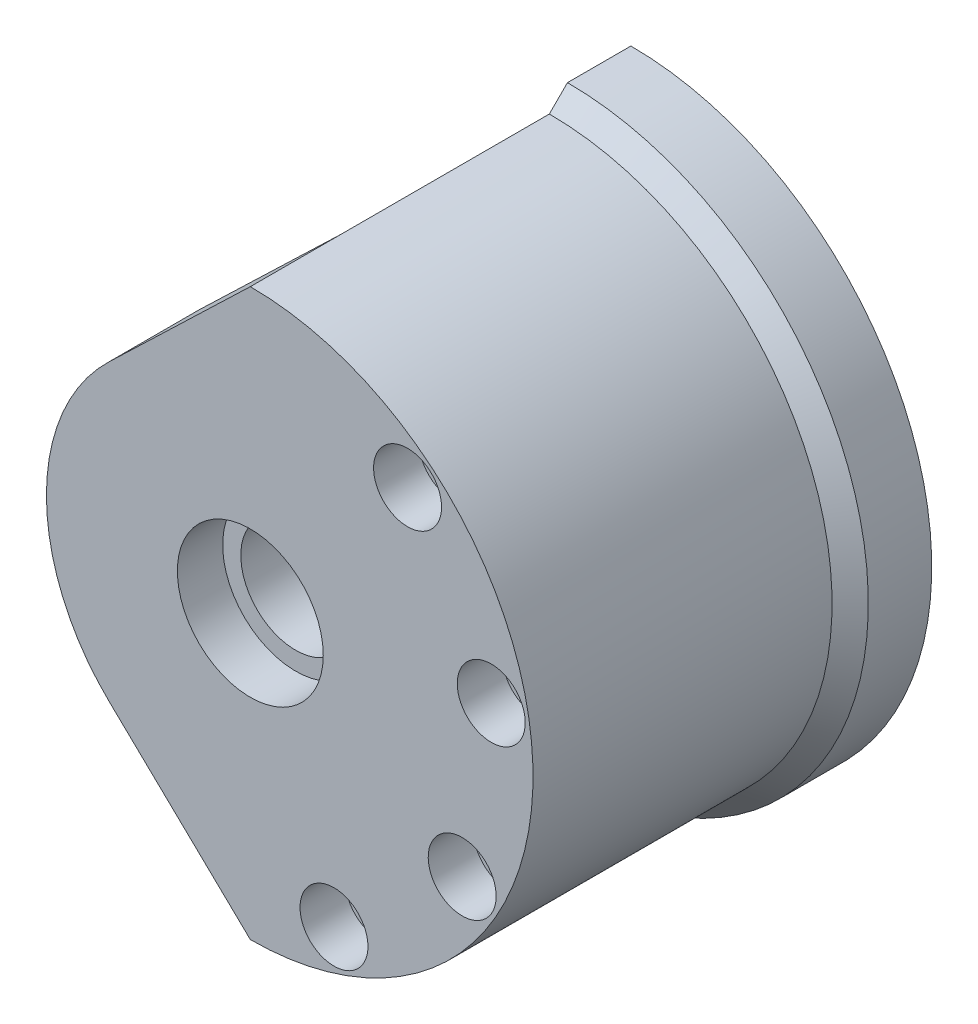
ISO-10303-21;
HEADER;
FILE_DESCRIPTION(('STEP AP214'),'2;1');
FILE_NAME('part.step','',(''),(''),'','','');
FILE_SCHEMA(('AUTOMOTIVE_DESIGN { 1 0 10303 214 1 1 1 1 }'));
ENDSEC;
DATA;
#1=APPLICATION_CONTEXT('core data for automotive mechanical design processes');
#2=APPLICATION_PROTOCOL_DEFINITION('international standard','automotive_design',2000,#1);
#3=PRODUCT_CONTEXT('',#1,'mechanical');
#4=PRODUCT('Part','Part','',(#3));
#5=PRODUCT_RELATED_PRODUCT_CATEGORY('part','',(#4));
#6=PRODUCT_DEFINITION_FORMATION('','',#4);
#7=PRODUCT_DEFINITION_CONTEXT('part definition',#1,'design');
#8=PRODUCT_DEFINITION('design','',#6,#7);
#9=PRODUCT_DEFINITION_SHAPE('','',#8);
#10=(LENGTH_UNIT() NAMED_UNIT(*) SI_UNIT(.MILLI.,.METRE.));
#11=(NAMED_UNIT(*) PLANE_ANGLE_UNIT() SI_UNIT($,.RADIAN.));
#12=(NAMED_UNIT(*) SI_UNIT($,.STERADIAN.) SOLID_ANGLE_UNIT());
#13=UNCERTAINTY_MEASURE_WITH_UNIT(LENGTH_MEASURE(1.E-05),#10,'distance_accuracy_value','');
#14=(GEOMETRIC_REPRESENTATION_CONTEXT(3) GLOBAL_UNCERTAINTY_ASSIGNED_CONTEXT((#13)) GLOBAL_UNIT_ASSIGNED_CONTEXT((#10,
#11,#12)) REPRESENTATION_CONTEXT('',''));
#15=CARTESIAN_POINT('',(0.,0.,0.));
#16=DIRECTION('',(0.,0.,1.));
#17=DIRECTION('',(1.,0.,0.));
#18=AXIS2_PLACEMENT_3D('',#15,#16,#17);
#19=CARTESIAN_POINT('',(0.,0.,0.));
#20=DIRECTION('',(1.,0.,0.));
#21=DIRECTION('',(0.,0.,-1.));
#22=AXIS2_PLACEMENT_3D('',#19,#20,#21);
#23=PLANE('',#22);
#24=DIRECTION('',(0.,0.,-1.));
#25=VECTOR('',#24,1.);
#26=CARTESIAN_POINT('',(0.,-31.2,40.));
#27=LINE('',#26,#25);
#28=CARTESIAN_POINT('',(0.,-31.2,30.));
#29=VERTEX_POINT('',#28);
#30=CARTESIAN_POINT('',(0.,-31.2,6.99999999999999));
#31=VERTEX_POINT('',#30);
#32=EDGE_CURVE('E135',#29,#31,#27,.T.);
#33=ORIENTED_EDGE('',*,*,#32,.F.);
#34=DIRECTION('',(0.,-1.,0.));
#35=VECTOR('',#34,1.);
#36=CARTESIAN_POINT('',(0.,0.,30.));
#37=LINE('',#36,#35);
#38=CARTESIAN_POINT('',(0.,-18.5,30.));
#39=VERTEX_POINT('',#38);
#40=EDGE_CURVE('E192',#39,#29,#37,.T.);
#41=ORIENTED_EDGE('',*,*,#40,.F.);
#42=CARTESIAN_POINT('',(0.,-18.5,26.));
#43=DIRECTION('',(1.,0.,0.));
#44=DIRECTION('',(0.,0.,-1.));
#45=AXIS2_PLACEMENT_3D('',#42,#43,#44);
#46=CIRCLE('',#45,4.);
#47=CARTESIAN_POINT('',(0.,-22.5,26.));
#48=VERTEX_POINT('',#47);
#49=EDGE_CURVE('E45',#39,#48,#46,.T.);
#50=ORIENTED_EDGE('',*,*,#49,.T.);
#51=DIRECTION('',(0.,0.,-1.));
#52=VECTOR('',#51,1.);
#53=CARTESIAN_POINT('',(0.,-22.5,40.));
#54=LINE('',#53,#52);
#55=CARTESIAN_POINT('',(0.,-22.5,0.));
#56=VERTEX_POINT('',#55);
#57=EDGE_CURVE('E197',#48,#56,#54,.T.);
#58=ORIENTED_EDGE('',*,*,#57,.T.);
#59=DIRECTION('',(0.,1.,0.));
#60=VECTOR('',#59,1.);
#61=CARTESIAN_POINT('',(0.,31.2,0.));
#62=LINE('',#61,#60);
#63=CARTESIAN_POINT('',(0.,-31.2,0.));
#64=VERTEX_POINT('',#63);
#65=EDGE_CURVE('E230',#64,#56,#62,.T.);
#66=ORIENTED_EDGE('',*,*,#65,.F.);
#67=DIRECTION('',(0.,0.,-1.));
#68=VECTOR('',#67,1.);
#69=CARTESIAN_POINT('',(0.,-31.2,5.));
#70=LINE('',#69,#68);
#71=CARTESIAN_POINT('',(0.,-31.2,-2.));
#72=VERTEX_POINT('',#71);
#73=EDGE_CURVE('E250',#64,#72,#70,.T.);
#74=ORIENTED_EDGE('',*,*,#73,.T.);
#75=DIRECTION('',(0.,-1.,0.));
#76=VECTOR('',#75,1.);
#77=CARTESIAN_POINT('',(0.,0.,-2.));
#78=LINE('',#77,#76);
#79=CARTESIAN_POINT('',(0.,-33.2,-2.));
#80=VERTEX_POINT('',#79);
#81=EDGE_CURVE('E307',#72,#80,#78,.T.);
#82=ORIENTED_EDGE('',*,*,#81,.T.);
#83=DIRECTION('',(0.,0.,-1.));
#84=VECTOR('',#83,1.);
#85=CARTESIAN_POINT('',(0.,-33.2,5.));
#86=LINE('',#85,#84);
#87=CARTESIAN_POINT('',(0.,-33.2,5.));
#88=VERTEX_POINT('',#87);
#89=EDGE_CURVE('E259',#88,#80,#86,.T.);
#90=ORIENTED_EDGE('',*,*,#89,.F.);
#91=DIRECTION('',(0.,-0.70710678118655,-0.707106781186545));
#92=VECTOR('',#91,1.);
#93=CARTESIAN_POINT('',(0.,0.,38.1999999999998));
#94=LINE('',#93,#92);
#95=EDGE_CURVE('E154',#88,#31,#94,.F.);
#96=ORIENTED_EDGE('',*,*,#95,.T.);
#97=EDGE_LOOP('',(#33,#41,#50,#58,#66,#74,#82,#90,#96));
#98=FACE_BOUND('',#97,.T.);
#99=ADVANCED_FACE('F37',(#98),#23,.F.);
#100=DIRECTION('',(0.,-1.,0.));
#101=VECTOR('',#100,1.);
#102=CARTESIAN_POINT('',(0.,0.,30.));
#103=LINE('',#102,#101);
#104=CARTESIAN_POINT('',(0.,31.2,30.));
#105=VERTEX_POINT('',#104);
#106=CARTESIAN_POINT('',(0.,18.5,30.));
#107=VERTEX_POINT('',#106);
#108=EDGE_CURVE('E186',#105,#107,#103,.T.);
#109=ORIENTED_EDGE('',*,*,#108,.F.);
#110=DIRECTION('',(0.,0.,1.));
#111=VECTOR('',#110,1.);
#112=CARTESIAN_POINT('',(0.,31.2,40.));
#113=LINE('',#112,#111);
#114=CARTESIAN_POINT('',(0.,31.2,6.99999999999999));
#115=VERTEX_POINT('',#114);
#116=EDGE_CURVE('E227',#115,#105,#113,.T.);
#117=ORIENTED_EDGE('',*,*,#116,.F.);
#118=DIRECTION('',(0.,-0.70710678118655,0.707106781186545));
#119=VECTOR('',#118,1.);
#120=CARTESIAN_POINT('',(0.,0.,38.1999999999998));
#121=LINE('',#120,#119);
#122=CARTESIAN_POINT('',(0.,33.2,5.));
#123=VERTEX_POINT('',#122);
#124=EDGE_CURVE('E184',#115,#123,#121,.F.);
#125=ORIENTED_EDGE('',*,*,#124,.T.);
#126=DIRECTION('',(0.,0.,-1.));
#127=VECTOR('',#126,1.);
#128=CARTESIAN_POINT('',(0.,33.2,5.));
#129=LINE('',#128,#127);
#130=CARTESIAN_POINT('',(0.,33.2,-2.));
#131=VERTEX_POINT('',#130);
#132=EDGE_CURVE('E263',#123,#131,#129,.T.);
#133=ORIENTED_EDGE('',*,*,#132,.T.);
#134=CARTESIAN_POINT('',(0.,31.2,-2.));
#135=VERTEX_POINT('',#134);
#136=EDGE_CURVE('E221',#131,#135,#78,.T.);
#137=ORIENTED_EDGE('',*,*,#136,.T.);
#138=DIRECTION('',(0.,0.,-1.));
#139=VECTOR('',#138,1.);
#140=CARTESIAN_POINT('',(0.,31.2,5.));
#141=LINE('',#140,#139);
#142=CARTESIAN_POINT('',(0.,31.2,0.));
#143=VERTEX_POINT('',#142);
#144=EDGE_CURVE('E258',#143,#135,#141,.T.);
#145=ORIENTED_EDGE('',*,*,#144,.F.);
#146=CARTESIAN_POINT('',(0.,22.5,0.));
#147=VERTEX_POINT('',#146);
#148=EDGE_CURVE('E134',#147,#143,#62,.T.);
#149=ORIENTED_EDGE('',*,*,#148,.F.);
#150=DIRECTION('',(0.,0.,-1.));
#151=VECTOR('',#150,1.);
#152=CARTESIAN_POINT('',(0.,22.5,40.));
#153=LINE('',#152,#151);
#154=CARTESIAN_POINT('',(0.,22.5,26.));
#155=VERTEX_POINT('',#154);
#156=EDGE_CURVE('E205',#147,#155,#153,.F.);
#157=ORIENTED_EDGE('',*,*,#156,.T.);
#158=CARTESIAN_POINT('',(0.,18.5,26.));
#159=DIRECTION('',(1.,0.,0.));
#160=DIRECTION('',(0.,0.,-1.));
#161=AXIS2_PLACEMENT_3D('',#158,#159,#160);
#162=CIRCLE('',#161,4.);
#163=EDGE_CURVE('E11',#155,#107,#162,.T.);
#164=ORIENTED_EDGE('',*,*,#163,.T.);
#165=EDGE_LOOP('',(#109,#117,#125,#133,#137,#145,#149,#157,#164));
#166=FACE_BOUND('',#165,.T.);
#167=ADVANCED_FACE('F209',(#166),#23,.F.);
#168=CARTESIAN_POINT('',(0.,0.,30.));
#169=DIRECTION('',(0.,0.,1.));
#170=DIRECTION('',(1.,0.,0.));
#171=AXIS2_PLACEMENT_3D('',#168,#169,#170);
#172=CYLINDRICAL_SURFACE('',#171,22.5);
#173=CARTESIAN_POINT('',(0.,0.,30.));
#174=DIRECTION('',(0.,0.,1.));
#175=DIRECTION('',(1.,0.,0.));
#176=AXIS2_PLACEMENT_3D('',#173,#174,#175);
#177=CIRCLE('',#176,22.5);
#178=CARTESIAN_POINT('',(-15.5874363560005,-16.2259615384615,30.));
#179=VERTEX_POINT('',#178);
#180=CARTESIAN_POINT('',(-15.5874363560005,16.2259615384615,30.));
#181=VERTEX_POINT('',#180);
#182=EDGE_CURVE('E217',#179,#181,#177,.F.);
#183=ORIENTED_EDGE('',*,*,#182,.F.);
#184=DIRECTION('',(0.,0.,1.));
#185=VECTOR('',#184,1.);
#186=CARTESIAN_POINT('',(-15.5874363560005,-16.2259615384615,8.38542158634593));
#187=LINE('',#186,#185);
#188=CARTESIAN_POINT('',(-15.5874363560005,-16.2259615384615,40.));
#189=VERTEX_POINT('',#188);
#190=EDGE_CURVE('E52',#179,#189,#187,.T.);
#191=ORIENTED_EDGE('',*,*,#190,.T.);
#192=CARTESIAN_POINT('',(0.,0.,40.));
#193=DIRECTION('',(0.,0.,1.));
#194=DIRECTION('',(1.,0.,0.));
#195=AXIS2_PLACEMENT_3D('',#192,#193,#194);
#196=CIRCLE('',#195,22.5);
#197=CARTESIAN_POINT('',(-15.5874363560005,16.2259615384615,40.));
#198=VERTEX_POINT('',#197);
#199=EDGE_CURVE('E144',#189,#198,#196,.F.);
#200=ORIENTED_EDGE('',*,*,#199,.T.);
#201=DIRECTION('',(0.,0.,1.));
#202=VECTOR('',#201,1.);
#203=CARTESIAN_POINT('',(-15.5874363560005,16.2259615384615,8.38542158634593));
#204=LINE('',#203,#202);
#205=EDGE_CURVE('E222',#181,#198,#204,.T.);
#206=ORIENTED_EDGE('',*,*,#205,.F.);
#207=EDGE_LOOP('',(#183,#191,#200,#206));
#208=FACE_BOUND('',#207,.T.);
#209=ADVANCED_FACE('F298',(#208),#172,.T.);
#210=CARTESIAN_POINT('',(0.,0.,40.));
#211=DIRECTION('',(0.,0.,-1.));
#212=DIRECTION('',(-1.,0.,0.));
#213=AXIS2_PLACEMENT_3D('',#210,#211,#212);
#214=CYLINDRICAL_SURFACE('',#213,31.2);
#215=CARTESIAN_POINT('',(0.,-31.2,40.));
#216=VERTEX_POINT('',#215);
#217=EDGE_CURVE('E126',#216,#29,#27,.T.);
#218=ORIENTED_EDGE('',*,*,#217,.T.);
#219=ORIENTED_EDGE('',*,*,#32,.T.);
#220=CARTESIAN_POINT('',(0.,0.,6.99999999999999));
#221=DIRECTION('',(0.,0.,-1.));
#222=DIRECTION('',(-1.,0.,0.));
#223=AXIS2_PLACEMENT_3D('',#220,#221,#222);
#224=CIRCLE('',#223,31.2);
#225=EDGE_CURVE('E151',#31,#115,#224,.F.);
#226=ORIENTED_EDGE('',*,*,#225,.T.);
#227=ORIENTED_EDGE('',*,*,#116,.T.);
#228=DIRECTION('',(0.,0.,1.));
#229=VECTOR('',#228,1.);
#230=CARTESIAN_POINT('',(0.,31.2,8.38542158634593));
#231=LINE('',#230,#229);
#232=CARTESIAN_POINT('',(0.,31.2,40.));
#233=VERTEX_POINT('',#232);
#234=EDGE_CURVE('E150',#105,#233,#231,.T.);
#235=ORIENTED_EDGE('',*,*,#234,.T.);
#236=CARTESIAN_POINT('',(0.,0.,40.));
#237=DIRECTION('',(0.,0.,1.));
#238=DIRECTION('',(1.,0.,0.));
#239=AXIS2_PLACEMENT_3D('',#236,#237,#238);
#240=CIRCLE('',#239,31.2);
#241=EDGE_CURVE('E143',#216,#233,#240,.T.);
#242=ORIENTED_EDGE('',*,*,#241,.F.);
#243=EDGE_LOOP('',(#218,#219,#226,#227,#235,#242));
#244=FACE_BOUND('',#243,.T.);
#245=ADVANCED_FACE('F147',(#244),#214,.T.);
#246=CARTESIAN_POINT('',(26.5898093313296,4.68850079700704,0.));
#247=DIRECTION('',(0.,0.,1.));
#248=DIRECTION('',(1.,0.,0.));
#249=AXIS2_PLACEMENT_3D('',#246,#247,#248);
#250=CYLINDRICAL_SURFACE('',#249,2.25);
#251=CARTESIAN_POINT('',(26.5898093313296,4.68850079700704,0.));
#252=DIRECTION('',(0.,0.,1.));
#253=DIRECTION('',(0.173648177666927,-0.984807753012209,0.));
#254=AXIS2_PLACEMENT_3D('',#251,#252,#253);
#255=CIRCLE('',#254,2.25);
#256=CARTESIAN_POINT('',(26.9805177310802,2.47268335272957,0.));
#257=VERTEX_POINT('',#256);
#258=EDGE_CURVE('E235',#257,#257,#255,.T.);
#259=ORIENTED_EDGE('',*,*,#258,.F.);
#260=EDGE_LOOP('',(#259));
#261=FACE_BOUND('',#260,.T.);
#262=CARTESIAN_POINT('',(26.5898093313296,4.68850079700704,35.));
#263=DIRECTION('',(0.,0.,1.));
#264=DIRECTION('',(1.,0.,0.));
#265=AXIS2_PLACEMENT_3D('',#262,#263,#264);
#266=CIRCLE('',#265,2.25);
#267=CARTESIAN_POINT('',(28.8398093313296,4.68850079700704,35.));
#268=VERTEX_POINT('',#267);
#269=EDGE_CURVE('E178',#268,#268,#266,.F.);
#270=ORIENTED_EDGE('',*,*,#269,.F.);
#271=EDGE_LOOP('',(#270));
#272=FACE_BOUND('',#271,.T.);
#273=ADVANCED_FACE('F339',(#261,#272),#250,.F.);
#274=CARTESIAN_POINT('',(23.3826859021798,-13.5000000000001,0.));
#275=DIRECTION('',(0.,0.,1.));
#276=DIRECTION('',(1.,0.,0.));
#277=AXIS2_PLACEMENT_3D('',#274,#275,#276);
#278=CYLINDRICAL_SURFACE('',#277,2.25);
#279=CARTESIAN_POINT('',(23.3826859021798,-13.5000000000001,0.));
#280=DIRECTION('',(0.,0.,1.));
#281=DIRECTION('',(-0.500000000000004,-0.866025403784436,0.));
#282=AXIS2_PLACEMENT_3D('',#279,#280,#281);
#283=CIRCLE('',#282,2.25);
#284=CARTESIAN_POINT('',(22.2576859021798,-15.4485571585151,0.));
#285=VERTEX_POINT('',#284);
#286=EDGE_CURVE('E239',#285,#285,#283,.T.);
#287=ORIENTED_EDGE('',*,*,#286,.F.);
#288=EDGE_LOOP('',(#287));
#289=FACE_BOUND('',#288,.T.);
#290=CARTESIAN_POINT('',(23.3826859021798,-13.5000000000001,35.));
#291=DIRECTION('',(0.,0.,1.));
#292=DIRECTION('',(1.,0.,0.));
#293=AXIS2_PLACEMENT_3D('',#290,#291,#292);
#294=CIRCLE('',#293,2.25);
#295=CARTESIAN_POINT('',(25.6326859021798,-13.5000000000001,35.));
#296=VERTEX_POINT('',#295);
#297=EDGE_CURVE('E174',#296,#296,#294,.F.);
#298=ORIENTED_EDGE('',*,*,#297,.F.);
#299=EDGE_LOOP('',(#298));
#300=FACE_BOUND('',#299,.T.);
#301=ADVANCED_FACE('F342',(#289,#300),#278,.F.);
#302=CARTESIAN_POINT('',(9.2345438697929,-25.3717007612196,0.));
#303=DIRECTION('',(0.,0.,1.));
#304=DIRECTION('',(1.,0.,0.));
#305=AXIS2_PLACEMENT_3D('',#302,#303,#304);
#306=CYLINDRICAL_SURFACE('',#305,2.25);
#307=CARTESIAN_POINT('',(9.2345438697929,-25.3717007612196,0.));
#308=DIRECTION('',(0.,0.,1.));
#309=DIRECTION('',(-0.939692620785911,-0.342020143325663,0.));
#310=AXIS2_PLACEMENT_3D('',#307,#308,#309);
#311=CIRCLE('',#310,2.25);
#312=CARTESIAN_POINT('',(7.12023547302461,-26.1412460837023,0.));
#313=VERTEX_POINT('',#312);
#314=EDGE_CURVE('E204',#313,#313,#311,.T.);
#315=ORIENTED_EDGE('',*,*,#314,.F.);
#316=EDGE_LOOP('',(#315));
#317=FACE_BOUND('',#316,.T.);
#318=CARTESIAN_POINT('',(9.2345438697929,-25.3717007612196,35.));
#319=DIRECTION('',(0.,0.,1.));
#320=DIRECTION('',(1.,0.,0.));
#321=AXIS2_PLACEMENT_3D('',#318,#319,#320);
#322=CIRCLE('',#321,2.25);
#323=CARTESIAN_POINT('',(11.4845438697929,-25.3717007612196,35.));
#324=VERTEX_POINT('',#323);
#325=EDGE_CURVE('E171',#324,#324,#322,.F.);
#326=ORIENTED_EDGE('',*,*,#325,.F.);
#327=EDGE_LOOP('',(#326));
#328=FACE_BOUND('',#327,.T.);
#329=ADVANCED_FACE('F346',(#317,#328),#306,.F.);
#330=CARTESIAN_POINT('',(17.3552654615366,20.6831999642124,0.));
#331=DIRECTION('',(0.,0.,1.));
#332=DIRECTION('',(1.,0.,0.));
#333=AXIS2_PLACEMENT_3D('',#330,#331,#332);
#334=CYLINDRICAL_SURFACE('',#333,2.25);
#335=CARTESIAN_POINT('',(17.3552654615366,20.6831999642124,0.));
#336=DIRECTION('',(0.,0.,1.));
#337=DIRECTION('',(0.766044443118977,-0.642787609686541,0.));
#338=AXIS2_PLACEMENT_3D('',#335,#336,#337);
#339=CIRCLE('',#338,2.25);
#340=CARTESIAN_POINT('',(19.0788654585543,19.2369278424177,0.));
#341=VERTEX_POINT('',#340);
#342=EDGE_CURVE('E238',#341,#341,#339,.T.);
#343=ORIENTED_EDGE('',*,*,#342,.F.);
#344=EDGE_LOOP('',(#343));
#345=FACE_BOUND('',#344,.T.);
#346=CARTESIAN_POINT('',(17.3552654615366,20.6831999642124,35.));
#347=DIRECTION('',(0.,0.,1.));
#348=DIRECTION('',(1.,0.,0.));
#349=AXIS2_PLACEMENT_3D('',#346,#347,#348);
#350=CIRCLE('',#349,2.25);
#351=CARTESIAN_POINT('',(19.6052654615366,20.6831999642124,35.));
#352=VERTEX_POINT('',#351);
#353=EDGE_CURVE('E167',#352,#352,#350,.F.);
#354=ORIENTED_EDGE('',*,*,#353,.F.);
#355=EDGE_LOOP('',(#354));
#356=FACE_BOUND('',#355,.T.);
#357=ADVANCED_FACE('F350',(#345,#356),#334,.F.);
#358=CARTESIAN_POINT('',(0.,0.,40.));
#359=DIRECTION('',(0.,0.,-1.));
#360=DIRECTION('',(-1.,0.,0.));
#361=AXIS2_PLACEMENT_3D('',#358,#359,#360);
#362=CYLINDRICAL_SURFACE('',#361,22.5);
#363=ORIENTED_EDGE('',*,*,#57,.F.);
#364=CARTESIAN_POINT('',(0.,0.,26.));
#365=DIRECTION('',(0.,0.,1.));
#366=DIRECTION('',(1.,0.,0.));
#367=AXIS2_PLACEMENT_3D('',#364,#365,#366);
#368=CIRCLE('',#367,22.5);
#369=EDGE_CURVE('E60',#48,#155,#368,.T.);
#370=ORIENTED_EDGE('',*,*,#369,.T.);
#371=ORIENTED_EDGE('',*,*,#156,.F.);
#372=CARTESIAN_POINT('',(0.,0.,0.));
#373=DIRECTION('',(0.,0.,1.));
#374=DIRECTION('',(1.,0.,0.));
#375=AXIS2_PLACEMENT_3D('',#372,#373,#374);
#376=CIRCLE('',#375,22.5);
#377=EDGE_CURVE('E157',#56,#147,#376,.T.);
#378=ORIENTED_EDGE('',*,*,#377,.F.);
#379=EDGE_LOOP('',(#363,#370,#371,#378));
#380=FACE_BOUND('',#379,.T.);
#381=ADVANCED_FACE('F202',(#380),#362,.F.);
#382=CARTESIAN_POINT('',(0.,0.,40.));
#383=DIRECTION('',(0.,0.,1.));
#384=DIRECTION('',(1.,0.,0.));
#385=AXIS2_PLACEMENT_3D('',#382,#383,#384);
#386=PLANE('',#385);
#387=ORIENTED_EDGE('',*,*,#199,.F.);
#388=DIRECTION('',(-0.721153846153846,0.692774949155579,0.));
#389=VECTOR('',#388,1.);
#390=CARTESIAN_POINT('',(-15.5874363560005,-16.2259615384615,40.));
#391=LINE('',#390,#389);
#392=EDGE_CURVE('E129',#216,#189,#391,.T.);
#393=ORIENTED_EDGE('',*,*,#392,.F.);
#394=ORIENTED_EDGE('',*,*,#241,.T.);
#395=DIRECTION('',(-0.721153846153846,-0.692774949155579,0.));
#396=VECTOR('',#395,1.);
#397=CARTESIAN_POINT('',(-15.5874363560005,16.2259615384615,40.));
#398=LINE('',#397,#396);
#399=EDGE_CURVE('E225',#233,#198,#398,.T.);
#400=ORIENTED_EDGE('',*,*,#399,.T.);
#401=EDGE_LOOP('',(#387,#393,#394,#400));
#402=FACE_BOUND('',#401,.T.);
#403=CARTESIAN_POINT('',(9.2345438697929,-25.3717007612196,40.));
#404=DIRECTION('',(0.,0.,1.));
#405=DIRECTION('',(-0.500000000000004,-0.866025403784436,0.));
#406=AXIS2_PLACEMENT_3D('',#403,#404,#405);
#407=CIRCLE('',#406,3.75);
#408=CARTESIAN_POINT('',(7.35954386979289,-28.6192960254112,40.));
#409=VERTEX_POINT('',#408);
#410=EDGE_CURVE('E261',#409,#409,#407,.T.);
#411=ORIENTED_EDGE('',*,*,#410,.F.);
#412=EDGE_LOOP('',(#411));
#413=FACE_BOUND('',#412,.T.);
#414=CARTESIAN_POINT('',(23.3826859021798,-13.5000000000001,40.));
#415=DIRECTION('',(0.,0.,1.));
#416=DIRECTION('',(0.173648177666927,-0.984807753012209,0.));
#417=AXIS2_PLACEMENT_3D('',#414,#415,#416);
#418=CIRCLE('',#417,3.75);
#419=CARTESIAN_POINT('',(24.0338665684308,-17.1930290737959,40.));
#420=VERTEX_POINT('',#419);
#421=EDGE_CURVE('E273',#420,#420,#418,.T.);
#422=ORIENTED_EDGE('',*,*,#421,.F.);
#423=EDGE_LOOP('',(#422));
#424=FACE_BOUND('',#423,.T.);
#425=CARTESIAN_POINT('',(26.5898093313296,4.68850079700704,40.));
#426=DIRECTION('',(0.,0.,1.));
#427=DIRECTION('',(0.766044443118977,-0.642787609686541,0.));
#428=AXIS2_PLACEMENT_3D('',#425,#426,#427);
#429=CIRCLE('',#428,3.75);
#430=CARTESIAN_POINT('',(29.4624759930258,2.27804726068252,40.));
#431=VERTEX_POINT('',#430);
#432=EDGE_CURVE('E272',#431,#431,#429,.T.);
#433=ORIENTED_EDGE('',*,*,#432,.F.);
#434=EDGE_LOOP('',(#433));
#435=FACE_BOUND('',#434,.T.);
#436=CARTESIAN_POINT('',(17.3552654615366,20.6831999642124,40.));
#437=DIRECTION('',(0.,0.,1.));
#438=DIRECTION('',(1.,0.,0.));
#439=AXIS2_PLACEMENT_3D('',#436,#437,#438);
#440=CIRCLE('',#439,3.75);
#441=CARTESIAN_POINT('',(21.1052654615366,20.6831999642124,40.));
#442=VERTEX_POINT('',#441);
#443=EDGE_CURVE('E180',#442,#442,#440,.T.);
#444=ORIENTED_EDGE('',*,*,#443,.F.);
#445=EDGE_LOOP('',(#444));
#446=FACE_BOUND('',#445,.T.);
#447=CARTESIAN_POINT('',(0.,0.,40.));
#448=DIRECTION('',(0.,0.,1.));
#449=DIRECTION('',(1.,0.,0.));
#450=AXIS2_PLACEMENT_3D('',#447,#448,#449);
#451=CIRCLE('',#450,8.05);
#452=CARTESIAN_POINT('',(8.05,0.,40.));
#453=VERTEX_POINT('',#452);
#454=EDGE_CURVE('E165',#453,#453,#451,.T.);
#455=ORIENTED_EDGE('',*,*,#454,.F.);
#456=EDGE_LOOP('',(#455));
#457=FACE_BOUND('',#456,.T.);
#458=ADVANCED_FACE('F140',(#402,#413,#424,#435,#446,#457),#386,.T.);
#459=CARTESIAN_POINT('',(0.,0.,0.));
#460=DIRECTION('',(0.,0.,1.));
#461=DIRECTION('',(1.,0.,0.));
#462=AXIS2_PLACEMENT_3D('',#459,#460,#461);
#463=PLANE('',#462);
#464=ORIENTED_EDGE('',*,*,#148,.T.);
#465=CARTESIAN_POINT('',(0.,0.,0.));
#466=DIRECTION('',(0.,0.,1.));
#467=DIRECTION('',(1.,0.,0.));
#468=AXIS2_PLACEMENT_3D('',#465,#466,#467);
#469=CIRCLE('',#468,31.2);
#470=EDGE_CURVE('E152',#64,#143,#469,.T.);
#471=ORIENTED_EDGE('',*,*,#470,.F.);
#472=ORIENTED_EDGE('',*,*,#65,.T.);
#473=ORIENTED_EDGE('',*,*,#377,.T.);
#474=EDGE_LOOP('',(#464,#471,#472,#473));
#475=FACE_BOUND('',#474,.T.);
#476=ORIENTED_EDGE('',*,*,#342,.T.);
#477=EDGE_LOOP('',(#476));
#478=FACE_BOUND('',#477,.T.);
#479=ORIENTED_EDGE('',*,*,#258,.T.);
#480=EDGE_LOOP('',(#479));
#481=FACE_BOUND('',#480,.T.);
#482=ORIENTED_EDGE('',*,*,#286,.T.);
#483=EDGE_LOOP('',(#482));
#484=FACE_BOUND('',#483,.T.);
#485=ORIENTED_EDGE('',*,*,#314,.T.);
#486=EDGE_LOOP('',(#485));
#487=FACE_BOUND('',#486,.T.);
#488=ADVANCED_FACE('F247',(#475,#478,#481,#484,#487),#463,.F.);
#489=CARTESIAN_POINT('',(0.,0.,30.));
#490=DIRECTION('',(0.,0.,1.));
#491=DIRECTION('',(1.,0.,0.));
#492=AXIS2_PLACEMENT_3D('',#489,#490,#491);
#493=PLANE('',#492);
#494=CARTESIAN_POINT('',(0.,0.,30.));
#495=DIRECTION('',(0.,0.,1.));
#496=DIRECTION('',(1.,0.,0.));
#497=AXIS2_PLACEMENT_3D('',#494,#495,#496);
#498=CIRCLE('',#497,6.05);
#499=CARTESIAN_POINT('',(6.05,0.,30.));
#500=VERTEX_POINT('',#499);
#501=EDGE_CURVE('E162',#500,#500,#498,.T.);
#502=ORIENTED_EDGE('',*,*,#501,.T.);
#503=EDGE_LOOP('',(#502));
#504=FACE_BOUND('',#503,.T.);
#505=CARTESIAN_POINT('',(0.,0.,30.));
#506=DIRECTION('',(0.,0.,1.));
#507=DIRECTION('',(1.,0.,0.));
#508=AXIS2_PLACEMENT_3D('',#505,#506,#507);
#509=CIRCLE('',#508,18.5);
#510=EDGE_CURVE('E189',#107,#39,#509,.F.);
#511=ORIENTED_EDGE('',*,*,#510,.T.);
#512=ORIENTED_EDGE('',*,*,#40,.T.);
#513=DIRECTION('',(0.721153846153846,-0.692774949155579,0.));
#514=VECTOR('',#513,1.);
#515=CARTESIAN_POINT('',(-15.5874363560005,-16.2259615384615,30.));
#516=LINE('',#515,#514);
#517=EDGE_CURVE('E130',#179,#29,#516,.T.);
#518=ORIENTED_EDGE('',*,*,#517,.F.);
#519=ORIENTED_EDGE('',*,*,#182,.T.);
#520=DIRECTION('',(0.721153846153846,0.692774949155579,0.));
#521=VECTOR('',#520,1.);
#522=CARTESIAN_POINT('',(-15.5874363560005,16.2259615384615,30.));
#523=LINE('',#522,#521);
#524=EDGE_CURVE('E215',#181,#105,#523,.T.);
#525=ORIENTED_EDGE('',*,*,#524,.T.);
#526=ORIENTED_EDGE('',*,*,#108,.T.);
#527=EDGE_LOOP('',(#511,#512,#518,#519,#525,#526));
#528=FACE_BOUND('',#527,.T.);
#529=ADVANCED_FACE('F213',(#504,#528),#493,.F.);
#530=CARTESIAN_POINT('',(0.,0.,35.));
#531=DIRECTION('',(0.,0.,1.));
#532=DIRECTION('',(1.,0.,0.));
#533=AXIS2_PLACEMENT_3D('',#530,#531,#532);
#534=CYLINDRICAL_SURFACE('',#533,8.05);
#535=CARTESIAN_POINT('',(0.,0.,35.));
#536=DIRECTION('',(0.,0.,1.));
#537=DIRECTION('',(1.,0.,0.));
#538=AXIS2_PLACEMENT_3D('',#535,#536,#537);
#539=CIRCLE('',#538,8.05);
#540=CARTESIAN_POINT('',(8.05,0.,35.));
#541=VERTEX_POINT('',#540);
#542=EDGE_CURVE('E291',#541,#541,#539,.T.);
#543=ORIENTED_EDGE('',*,*,#542,.F.);
#544=EDGE_LOOP('',(#543));
#545=FACE_BOUND('',#544,.T.);
#546=ORIENTED_EDGE('',*,*,#454,.T.);
#547=EDGE_LOOP('',(#546));
#548=FACE_BOUND('',#547,.T.);
#549=ADVANCED_FACE('F555',(#545,#548),#534,.F.);
#550=CARTESIAN_POINT('',(0.,0.,35.));
#551=DIRECTION('',(0.,0.,1.));
#552=DIRECTION('',(1.,0.,0.));
#553=AXIS2_PLACEMENT_3D('',#550,#551,#552);
#554=PLANE('',#553);
#555=CARTESIAN_POINT('',(0.,0.,35.));
#556=DIRECTION('',(0.,0.,1.));
#557=DIRECTION('',(1.,0.,0.));
#558=AXIS2_PLACEMENT_3D('',#555,#556,#557);
#559=CIRCLE('',#558,6.05);
#560=CARTESIAN_POINT('',(6.05,0.,35.));
#561=VERTEX_POINT('',#560);
#562=EDGE_CURVE('E166',#561,#561,#559,.T.);
#563=ORIENTED_EDGE('',*,*,#562,.F.);
#564=EDGE_LOOP('',(#563));
#565=FACE_BOUND('',#564,.T.);
#566=ORIENTED_EDGE('',*,*,#542,.T.);
#567=EDGE_LOOP('',(#566));
#568=FACE_BOUND('',#567,.T.);
#569=ADVANCED_FACE('F545',(#565,#568),#554,.T.);
#570=CARTESIAN_POINT('',(0.,0.,0.));
#571=DIRECTION('',(0.,0.,1.));
#572=DIRECTION('',(1.,0.,0.));
#573=AXIS2_PLACEMENT_3D('',#570,#571,#572);
#574=CYLINDRICAL_SURFACE('',#573,6.05);
#575=ORIENTED_EDGE('',*,*,#562,.T.);
#576=EDGE_LOOP('',(#575));
#577=FACE_BOUND('',#576,.T.);
#578=ORIENTED_EDGE('',*,*,#501,.F.);
#579=EDGE_LOOP('',(#578));
#580=FACE_BOUND('',#579,.T.);
#581=ADVANCED_FACE('F529',(#577,#580),#574,.F.);
#582=CARTESIAN_POINT('',(17.3552654615366,20.6831999642124,35.));
#583=DIRECTION('',(0.,0.,1.));
#584=DIRECTION('',(1.,0.,0.));
#585=AXIS2_PLACEMENT_3D('',#582,#583,#584);
#586=PLANE('',#585);
#587=CARTESIAN_POINT('',(17.3552654615366,20.6831999642124,35.));
#588=DIRECTION('',(0.,0.,1.));
#589=DIRECTION('',(1.,0.,0.));
#590=AXIS2_PLACEMENT_3D('',#587,#588,#589);
#591=CIRCLE('',#590,3.75);
#592=CARTESIAN_POINT('',(21.1052654615366,20.6831999642124,35.));
#593=VERTEX_POINT('',#592);
#594=EDGE_CURVE('E170',#593,#593,#591,.T.);
#595=ORIENTED_EDGE('',*,*,#594,.T.);
#596=EDGE_LOOP('',(#595));
#597=FACE_BOUND('',#596,.T.);
#598=ORIENTED_EDGE('',*,*,#353,.T.);
#599=EDGE_LOOP('',(#598));
#600=FACE_BOUND('',#599,.T.);
#601=ADVANCED_FACE('F519',(#597,#600),#586,.T.);
#602=CARTESIAN_POINT('',(17.3552654615366,20.6831999642124,35.));
#603=DIRECTION('',(0.,0.,1.));
#604=DIRECTION('',(1.,0.,0.));
#605=AXIS2_PLACEMENT_3D('',#602,#603,#604);
#606=CYLINDRICAL_SURFACE('',#605,3.75);
#607=ORIENTED_EDGE('',*,*,#594,.F.);
#608=EDGE_LOOP('',(#607));
#609=FACE_BOUND('',#608,.T.);
#610=ORIENTED_EDGE('',*,*,#443,.T.);
#611=EDGE_LOOP('',(#610));
#612=FACE_BOUND('',#611,.T.);
#613=ADVANCED_FACE('F491',(#609,#612),#606,.F.);
#614=CARTESIAN_POINT('',(9.2345438697929,-25.3717007612196,35.));
#615=DIRECTION('',(0.,0.,1.));
#616=DIRECTION('',(-0.500000000000004,-0.866025403784436,0.));
#617=AXIS2_PLACEMENT_3D('',#614,#615,#616);
#618=PLANE('',#617);
#619=CARTESIAN_POINT('',(9.2345438697929,-25.3717007612196,35.));
#620=DIRECTION('',(0.,0.,1.));
#621=DIRECTION('',(-0.500000000000004,-0.866025403784436,0.));
#622=AXIS2_PLACEMENT_3D('',#619,#620,#621);
#623=CIRCLE('',#622,3.75);
#624=CARTESIAN_POINT('',(7.35954386979289,-28.6192960254112,35.));
#625=VERTEX_POINT('',#624);
#626=EDGE_CURVE('E276',#625,#625,#623,.T.);
#627=ORIENTED_EDGE('',*,*,#626,.T.);
#628=EDGE_LOOP('',(#627));
#629=FACE_BOUND('',#628,.T.);
#630=ORIENTED_EDGE('',*,*,#325,.T.);
#631=EDGE_LOOP('',(#630));
#632=FACE_BOUND('',#631,.T.);
#633=ADVANCED_FACE('F481',(#629,#632),#618,.T.);
#634=CARTESIAN_POINT('',(9.2345438697929,-25.3717007612196,35.));
#635=DIRECTION('',(0.,0.,1.));
#636=DIRECTION('',(1.,0.,0.));
#637=AXIS2_PLACEMENT_3D('',#634,#635,#636);
#638=CYLINDRICAL_SURFACE('',#637,3.75);
#639=ORIENTED_EDGE('',*,*,#626,.F.);
#640=EDGE_LOOP('',(#639));
#641=FACE_BOUND('',#640,.T.);
#642=ORIENTED_EDGE('',*,*,#410,.T.);
#643=EDGE_LOOP('',(#642));
#644=FACE_BOUND('',#643,.T.);
#645=ADVANCED_FACE('F471',(#641,#644),#638,.F.);
#646=CARTESIAN_POINT('',(23.3826859021798,-13.5000000000001,35.));
#647=DIRECTION('',(0.,0.,1.));
#648=DIRECTION('',(0.173648177666927,-0.984807753012209,0.));
#649=AXIS2_PLACEMENT_3D('',#646,#647,#648);
#650=PLANE('',#649);
#651=CARTESIAN_POINT('',(23.3826859021798,-13.5000000000001,35.));
#652=DIRECTION('',(0.,0.,1.));
#653=DIRECTION('',(0.173648177666927,-0.984807753012209,0.));
#654=AXIS2_PLACEMENT_3D('',#651,#652,#653);
#655=CIRCLE('',#654,3.75);
#656=CARTESIAN_POINT('',(24.0338665684308,-17.1930290737959,35.));
#657=VERTEX_POINT('',#656);
#658=EDGE_CURVE('E269',#657,#657,#655,.T.);
#659=ORIENTED_EDGE('',*,*,#658,.T.);
#660=EDGE_LOOP('',(#659));
#661=FACE_BOUND('',#660,.T.);
#662=ORIENTED_EDGE('',*,*,#297,.T.);
#663=EDGE_LOOP('',(#662));
#664=FACE_BOUND('',#663,.T.);
#665=ADVANCED_FACE('F461',(#661,#664),#650,.T.);
#666=CARTESIAN_POINT('',(23.3826859021798,-13.5000000000001,35.));
#667=DIRECTION('',(0.,0.,1.));
#668=DIRECTION('',(1.,0.,0.));
#669=AXIS2_PLACEMENT_3D('',#666,#667,#668);
#670=CYLINDRICAL_SURFACE('',#669,3.75);
#671=ORIENTED_EDGE('',*,*,#658,.F.);
#672=EDGE_LOOP('',(#671));
#673=FACE_BOUND('',#672,.T.);
#674=ORIENTED_EDGE('',*,*,#421,.T.);
#675=EDGE_LOOP('',(#674));
#676=FACE_BOUND('',#675,.T.);
#677=ADVANCED_FACE('F451',(#673,#676),#670,.F.);
#678=CARTESIAN_POINT('',(26.5898093313296,4.68850079700704,35.));
#679=DIRECTION('',(0.,0.,1.));
#680=DIRECTION('',(0.766044443118977,-0.642787609686541,0.));
#681=AXIS2_PLACEMENT_3D('',#678,#679,#680);
#682=PLANE('',#681);
#683=CARTESIAN_POINT('',(26.5898093313296,4.68850079700704,35.));
#684=DIRECTION('',(0.,0.,1.));
#685=DIRECTION('',(0.766044443118977,-0.642787609686541,0.));
#686=AXIS2_PLACEMENT_3D('',#683,#684,#685);
#687=CIRCLE('',#686,3.75);
#688=CARTESIAN_POINT('',(29.4624759930258,2.27804726068252,35.));
#689=VERTEX_POINT('',#688);
#690=EDGE_CURVE('E175',#689,#689,#687,.T.);
#691=ORIENTED_EDGE('',*,*,#690,.T.);
#692=EDGE_LOOP('',(#691));
#693=FACE_BOUND('',#692,.T.);
#694=ORIENTED_EDGE('',*,*,#269,.T.);
#695=EDGE_LOOP('',(#694));
#696=FACE_BOUND('',#695,.T.);
#697=ADVANCED_FACE('F440',(#693,#696),#682,.T.);
#698=CARTESIAN_POINT('',(26.5898093313296,4.68850079700704,35.));
#699=DIRECTION('',(0.,0.,1.));
#700=DIRECTION('',(1.,0.,0.));
#701=AXIS2_PLACEMENT_3D('',#698,#699,#700);
#702=CYLINDRICAL_SURFACE('',#701,3.75);
#703=ORIENTED_EDGE('',*,*,#690,.F.);
#704=EDGE_LOOP('',(#703));
#705=FACE_BOUND('',#704,.T.);
#706=ORIENTED_EDGE('',*,*,#432,.T.);
#707=EDGE_LOOP('',(#706));
#708=FACE_BOUND('',#707,.T.);
#709=ADVANCED_FACE('F431',(#705,#708),#702,.F.);
#710=CARTESIAN_POINT('',(0.,0.,5.));
#711=DIRECTION('',(0.,0.,-1.));
#712=DIRECTION('',(-1.,0.,0.));
#713=AXIS2_PLACEMENT_3D('',#710,#711,#712);
#714=CYLINDRICAL_SURFACE('',#713,31.2);
#715=ORIENTED_EDGE('',*,*,#73,.F.);
#716=ORIENTED_EDGE('',*,*,#470,.T.);
#717=ORIENTED_EDGE('',*,*,#144,.T.);
#718=CARTESIAN_POINT('',(0.,0.,-2.));
#719=DIRECTION('',(0.,0.,-1.));
#720=DIRECTION('',(-1.,0.,0.));
#721=AXIS2_PLACEMENT_3D('',#718,#719,#720);
#722=CIRCLE('',#721,31.2);
#723=EDGE_CURVE('E257',#135,#72,#722,.T.);
#724=ORIENTED_EDGE('',*,*,#723,.T.);
#725=EDGE_LOOP('',(#715,#716,#717,#724));
#726=FACE_BOUND('',#725,.T.);
#727=ADVANCED_FACE('F254',(#726),#714,.F.);
#728=CARTESIAN_POINT('',(0.,0.,5.));
#729=DIRECTION('',(0.,0.,-1.));
#730=DIRECTION('',(-1.,0.,0.));
#731=AXIS2_PLACEMENT_3D('',#728,#729,#730);
#732=CYLINDRICAL_SURFACE('',#731,33.2);
#733=ORIENTED_EDGE('',*,*,#89,.T.);
#734=CARTESIAN_POINT('',(0.,0.,-2.));
#735=DIRECTION('',(0.,0.,-1.));
#736=DIRECTION('',(-1.,0.,0.));
#737=AXIS2_PLACEMENT_3D('',#734,#735,#736);
#738=CIRCLE('',#737,33.2);
#739=EDGE_CURVE('E306',#131,#80,#738,.T.);
#740=ORIENTED_EDGE('',*,*,#739,.F.);
#741=ORIENTED_EDGE('',*,*,#132,.F.);
#742=CARTESIAN_POINT('',(0.,0.,5.));
#743=DIRECTION('',(0.,0.,-1.));
#744=DIRECTION('',(-1.,0.,0.));
#745=AXIS2_PLACEMENT_3D('',#742,#743,#744);
#746=CIRCLE('',#745,33.2);
#747=EDGE_CURVE('E268',#123,#88,#746,.T.);
#748=ORIENTED_EDGE('',*,*,#747,.T.);
#749=EDGE_LOOP('',(#733,#740,#741,#748));
#750=FACE_BOUND('',#749,.T.);
#751=ADVANCED_FACE('F314',(#750),#732,.T.);
#752=CARTESIAN_POINT('',(0.,0.,-2.));
#753=DIRECTION('',(0.,0.,-1.));
#754=DIRECTION('',(-1.,0.,0.));
#755=AXIS2_PLACEMENT_3D('',#752,#753,#754);
#756=PLANE('',#755);
#757=ORIENTED_EDGE('',*,*,#136,.F.);
#758=ORIENTED_EDGE('',*,*,#739,.T.);
#759=ORIENTED_EDGE('',*,*,#81,.F.);
#760=ORIENTED_EDGE('',*,*,#723,.F.);
#761=EDGE_LOOP('',(#757,#758,#759,#760));
#762=FACE_BOUND('',#761,.T.);
#763=ADVANCED_FACE('F321',(#762),#756,.T.);
#764=CARTESIAN_POINT('',(0.,0.,5.));
#765=DIRECTION('',(0.,0.,-1.));
#766=DIRECTION('',(-1.,0.,0.));
#767=AXIS2_PLACEMENT_3D('',#764,#765,#766);
#768=CONICAL_SURFACE('',#767,33.2,0.785398163397452);
#769=ORIENTED_EDGE('',*,*,#124,.F.);
#770=ORIENTED_EDGE('',*,*,#225,.F.);
#771=ORIENTED_EDGE('',*,*,#95,.F.);
#772=ORIENTED_EDGE('',*,*,#747,.F.);
#773=EDGE_LOOP('',(#769,#770,#771,#772));
#774=FACE_BOUND('',#773,.T.);
#775=ADVANCED_FACE('F318',(#774),#768,.T.);
#776=CARTESIAN_POINT('',(0.,0.,26.));
#777=DIRECTION('',(0.,0.,1.));
#778=DIRECTION('',(1.,0.,0.));
#779=AXIS2_PLACEMENT_3D('',#776,#777,#778);
#780=TOROIDAL_SURFACE('',#779,18.5,4.);
#781=ORIENTED_EDGE('',*,*,#163,.F.);
#782=ORIENTED_EDGE('',*,*,#369,.F.);
#783=ORIENTED_EDGE('',*,*,#49,.F.);
#784=ORIENTED_EDGE('',*,*,#510,.F.);
#785=EDGE_LOOP('',(#781,#782,#783,#784));
#786=FACE_BOUND('',#785,.T.);
#787=ADVANCED_FACE('F39',(#786),#780,.F.);
#788=CARTESIAN_POINT('',(-15.5874363560005,16.2259615384615,8.38542158634593));
#789=DIRECTION('',(-0.692774949155579,0.721153846153846,0.));
#790=DIRECTION('',(-0.721153846153846,-0.692774949155579,0.));
#791=AXIS2_PLACEMENT_3D('',#788,#789,#790);
#792=PLANE('',#791);
#793=ORIENTED_EDGE('',*,*,#524,.F.);
#794=ORIENTED_EDGE('',*,*,#205,.T.);
#795=ORIENTED_EDGE('',*,*,#399,.F.);
#796=ORIENTED_EDGE('',*,*,#234,.F.);
#797=EDGE_LOOP('',(#793,#794,#795,#796));
#798=FACE_BOUND('',#797,.T.);
#799=ADVANCED_FACE('F224',(#798),#792,.T.);
#800=CARTESIAN_POINT('',(-15.5874363560005,-16.2259615384615,8.38542158634593));
#801=DIRECTION('',(0.692774949155579,0.721153846153846,0.));
#802=DIRECTION('',(-0.721153846153846,0.692774949155579,0.));
#803=AXIS2_PLACEMENT_3D('',#800,#801,#802);
#804=PLANE('',#803);
#805=ORIENTED_EDGE('',*,*,#190,.F.);
#806=ORIENTED_EDGE('',*,*,#517,.T.);
#807=ORIENTED_EDGE('',*,*,#217,.F.);
#808=ORIENTED_EDGE('',*,*,#392,.T.);
#809=EDGE_LOOP('',(#805,#806,#807,#808));
#810=FACE_BOUND('',#809,.T.);
#811=ADVANCED_FACE('F128',(#810),#804,.F.);
#812=CLOSED_SHELL('',(#99,#167,#209,#245,#273,#301,#329,#357,#381,#458,#488,#529,#549,#569,#581,
#601,#613,#633,#645,#665,#677,#697,#709,#727,#751,#763,#775,#787,#799,#811));
#813=MANIFOLD_SOLID_BREP('B2',#812);
#814=ADVANCED_BREP_SHAPE_REPRESENTATION('',(#18,#813),#14);
#815=SHAPE_DEFINITION_REPRESENTATION(#9,#814);
ENDSEC;
END-ISO-10303-21;
